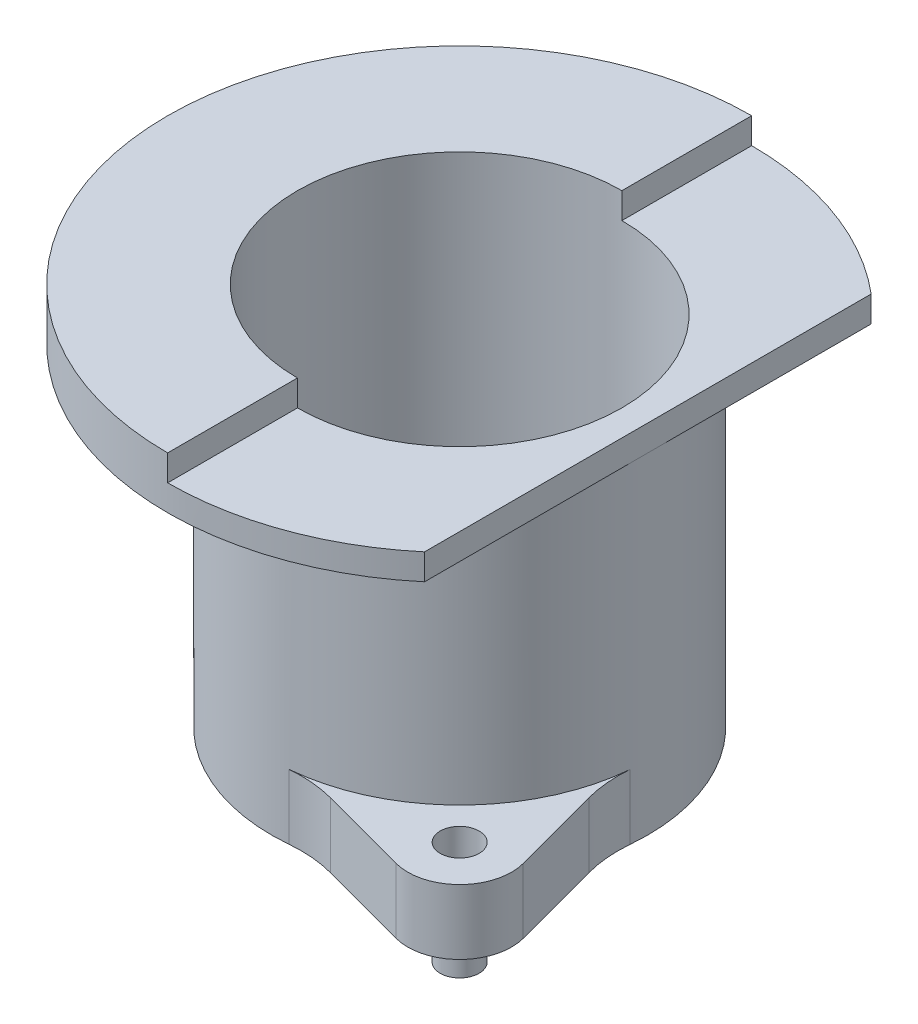
ISO-10303-21;
HEADER;
FILE_DESCRIPTION(('STEP AP214'),'2;1');
FILE_NAME('part.step','',(''),(''),'','','');
FILE_SCHEMA(('AUTOMOTIVE_DESIGN { 1 0 10303 214 1 1 1 1 }'));
ENDSEC;
DATA;
#1=APPLICATION_CONTEXT('core data for automotive mechanical design processes');
#2=APPLICATION_PROTOCOL_DEFINITION('international standard','automotive_design',2000,#1);
#3=PRODUCT_CONTEXT('',#1,'mechanical');
#4=PRODUCT('Part','Part','',(#3));
#5=PRODUCT_RELATED_PRODUCT_CATEGORY('part','',(#4));
#6=PRODUCT_DEFINITION_FORMATION('','',#4);
#7=PRODUCT_DEFINITION_CONTEXT('part definition',#1,'design');
#8=PRODUCT_DEFINITION('design','',#6,#7);
#9=PRODUCT_DEFINITION_SHAPE('','',#8);
#10=(LENGTH_UNIT() NAMED_UNIT(*) SI_UNIT(.MILLI.,.METRE.));
#11=(NAMED_UNIT(*) PLANE_ANGLE_UNIT() SI_UNIT($,.RADIAN.));
#12=(NAMED_UNIT(*) SI_UNIT($,.STERADIAN.) SOLID_ANGLE_UNIT());
#13=UNCERTAINTY_MEASURE_WITH_UNIT(LENGTH_MEASURE(1.E-05),#10,'distance_accuracy_value','');
#14=(GEOMETRIC_REPRESENTATION_CONTEXT(3) GLOBAL_UNCERTAINTY_ASSIGNED_CONTEXT((#13)) GLOBAL_UNIT_ASSIGNED_CONTEXT((#10,
#11,#12)) REPRESENTATION_CONTEXT('',''));
#15=CARTESIAN_POINT('',(0.,0.,0.));
#16=DIRECTION('',(0.,0.,1.));
#17=DIRECTION('',(1.,0.,0.));
#18=AXIS2_PLACEMENT_3D('',#15,#16,#17);
#19=CARTESIAN_POINT('',(12.7279220613579,-3.,12.7279220613577));
#20=DIRECTION('',(0.,1.,0.));
#21=DIRECTION('',(0.,0.,-1.));
#22=AXIS2_PLACEMENT_3D('',#19,#20,#21);
#23=CYLINDRICAL_SURFACE('',#22,1.49999999999999);
#24=CARTESIAN_POINT('',(12.7279220613579,-3.,12.7279220613577));
#25=DIRECTION('',(0.,1.,0.));
#26=DIRECTION('',(0.,0.,-1.));
#27=AXIS2_PLACEMENT_3D('',#24,#25,#26);
#28=CIRCLE('',#27,1.49999999999999);
#29=CARTESIAN_POINT('',(12.7279220613579,-3.,11.2279220613577));
#30=VERTEX_POINT('',#29);
#31=EDGE_CURVE('E54',#30,#30,#28,.T.);
#32=ORIENTED_EDGE('',*,*,#31,.F.);
#33=EDGE_LOOP('',(#32));
#34=FACE_BOUND('',#33,.T.);
#35=CARTESIAN_POINT('',(12.7279220613579,0.,12.7279220613577));
#36=DIRECTION('',(0.,1.,0.));
#37=DIRECTION('',(0.,0.,-1.));
#38=AXIS2_PLACEMENT_3D('',#35,#36,#37);
#39=CIRCLE('',#38,1.49999999999999);
#40=CARTESIAN_POINT('',(12.7279220613579,0.,11.2279220613577));
#41=VERTEX_POINT('',#40);
#42=EDGE_CURVE('E12',#41,#41,#39,.T.);
#43=ORIENTED_EDGE('',*,*,#42,.T.);
#44=EDGE_LOOP('',(#43));
#45=FACE_BOUND('',#44,.T.);
#46=ADVANCED_FACE('F49',(#34,#45),#23,.F.);
#47=OPEN_SHELL('',(#46));
#48=SHELL_BASED_SURFACE_MODEL('B2',(#47));
#49=CARTESIAN_POINT('',(-12.7279220613579,-3.,-12.7279220613578));
#50=DIRECTION('',(0.,1.,0.));
#51=DIRECTION('',(0.,0.,-1.));
#52=AXIS2_PLACEMENT_3D('',#49,#50,#51);
#53=CYLINDRICAL_SURFACE('',#52,1.50000000000001);
#54=CARTESIAN_POINT('',(-12.7279220613579,-3.,-12.7279220613578));
#55=DIRECTION('',(0.,1.,0.));
#56=DIRECTION('',(0.,0.,-1.));
#57=AXIS2_PLACEMENT_3D('',#54,#55,#56);
#58=CIRCLE('',#57,1.50000000000001);
#59=CARTESIAN_POINT('',(-12.7279220613579,-3.,-14.2279220613579));
#60=VERTEX_POINT('',#59);
#61=EDGE_CURVE('E90',#60,#60,#58,.T.);
#62=ORIENTED_EDGE('',*,*,#61,.F.);
#63=EDGE_LOOP('',(#62));
#64=FACE_BOUND('',#63,.T.);
#65=CARTESIAN_POINT('',(-12.7279220613579,0.,-12.7279220613578));
#66=DIRECTION('',(0.,1.,0.));
#67=DIRECTION('',(0.,0.,-1.));
#68=AXIS2_PLACEMENT_3D('',#65,#66,#67);
#69=CIRCLE('',#68,1.50000000000001);
#70=CARTESIAN_POINT('',(-12.7279220613579,0.,-14.2279220613579));
#71=VERTEX_POINT('',#70);
#72=EDGE_CURVE('E47',#71,#71,#69,.T.);
#73=ORIENTED_EDGE('',*,*,#72,.T.);
#74=EDGE_LOOP('',(#73));
#75=FACE_BOUND('',#74,.T.);
#76=ADVANCED_FACE('F85',(#64,#75),#53,.F.);
#77=OPEN_SHELL('',(#76));
#78=SHELL_BASED_SURFACE_MODEL('B6',(#77));
#79=CARTESIAN_POINT('',(0.,0.,0.));
#80=DIRECTION('',(0.,1.,0.));
#81=DIRECTION('',(0.,0.,1.));
#82=AXIS2_PLACEMENT_3D('',#79,#80,#81);
#83=PLANE('',#82);
#84=CARTESIAN_POINT('',(0.,0.,0.));
#85=DIRECTION('',(0.,1.,0.));
#86=DIRECTION('',(0.,0.,1.));
#87=AXIS2_PLACEMENT_3D('',#84,#85,#86);
#88=CIRCLE('',#87,14.5);
#89=CARTESIAN_POINT('',(14.4413952553677,0.,1.30234522237487));
#90=VERTEX_POINT('',#89);
#91=CARTESIAN_POINT('',(-1.30234522237493,0.,-14.4413952553677));
#92=VERTEX_POINT('',#91);
#93=EDGE_CURVE('E505',#90,#92,#88,.T.);
#94=ORIENTED_EDGE('',*,*,#93,.F.);
#95=CARTESIAN_POINT('',(24.4009781901041,0.,2.2005143412541));
#96=DIRECTION('',(0.,1.,0.));
#97=DIRECTION('',(0.,0.,1.));
#98=AXIS2_PLACEMENT_3D('',#95,#96,#97);
#99=CIRCLE('',#98,10.);
#100=CARTESIAN_POINT('',(14.7417199272134,0.,4.78870479227938));
#101=VERTEX_POINT('',#100);
#102=EDGE_CURVE('E541',#90,#101,#99,.T.);
#103=ORIENTED_EDGE('',*,*,#102,.T.);
#104=DIRECTION('',(-0.258819045102528,0.,-0.965925826289066));
#105=VECTOR('',#104,1.);
#106=CARTESIAN_POINT('',(12.5570357417578,0.,-3.36464758633286));
#107=LINE('',#106,#105);
#108=CARTESIAN_POINT('',(16.5916253665142,0.,11.6926458809476));
#109=VERTEX_POINT('',#108);
#110=EDGE_CURVE('E435',#109,#101,#107,.T.);
#111=ORIENTED_EDGE('',*,*,#110,.F.);
#112=CARTESIAN_POINT('',(12.7279220613579,0.,12.7279220613577));
#113=DIRECTION('',(0.,-1.,0.));
#114=DIRECTION('',(0.,0.,-1.));
#115=AXIS2_PLACEMENT_3D('',#112,#113,#114);
#116=CIRCLE('',#115,4.);
#117=CARTESIAN_POINT('',(11.6926458809478,0.,16.591625366514));
#118=VERTEX_POINT('',#117);
#119=EDGE_CURVE('E438',#118,#109,#116,.F.);
#120=ORIENTED_EDGE('',*,*,#119,.F.);
#121=DIRECTION('',(-0.965925826289069,0.,-0.258819045102519));
#122=VECTOR('',#121,1.);
#123=CARTESIAN_POINT('',(-3.36464758633272,0.,12.5570357417578));
#124=LINE('',#123,#122);
#125=CARTESIAN_POINT('',(4.78870479227972,0.,14.7417199272134));
#126=VERTEX_POINT('',#125);
#127=EDGE_CURVE('E440',#118,#126,#124,.T.);
#128=ORIENTED_EDGE('',*,*,#127,.T.);
#129=CARTESIAN_POINT('',(2.20051434125453,0.,24.400978190104));
#130=DIRECTION('',(0.,1.,0.));
#131=DIRECTION('',(0.,0.,1.));
#132=AXIS2_PLACEMENT_3D('',#129,#130,#131);
#133=CIRCLE('',#132,10.);
#134=CARTESIAN_POINT('',(1.30234522237513,0.,14.4413952553677));
#135=VERTEX_POINT('',#134);
#136=EDGE_CURVE('E267',#126,#135,#133,.T.);
#137=ORIENTED_EDGE('',*,*,#136,.T.);
#138=CARTESIAN_POINT('',(-14.4413952553677,0.,-1.3023452223749));
#139=VERTEX_POINT('',#138);
#140=EDGE_CURVE('E500',#139,#135,#88,.T.);
#141=ORIENTED_EDGE('',*,*,#140,.F.);
#142=CARTESIAN_POINT('',(-24.4009781901041,0.,-2.20051434125414));
#143=DIRECTION('',(0.,1.,0.));
#144=DIRECTION('',(0.,0.,1.));
#145=AXIS2_PLACEMENT_3D('',#142,#143,#144);
#146=CIRCLE('',#145,10.);
#147=CARTESIAN_POINT('',(-14.7417199272134,0.,-4.78870479227943));
#148=VERTEX_POINT('',#147);
#149=EDGE_CURVE('E533',#139,#148,#146,.T.);
#150=ORIENTED_EDGE('',*,*,#149,.T.);
#151=DIRECTION('',(0.258819045102528,0.,0.965925826289066));
#152=VECTOR('',#151,1.);
#153=CARTESIAN_POINT('',(-12.5570357417578,0.,3.36464758633285));
#154=LINE('',#153,#152);
#155=CARTESIAN_POINT('',(-16.5916253665142,0.,-11.6926458809477));
#156=VERTEX_POINT('',#155);
#157=EDGE_CURVE('E429',#156,#148,#154,.T.);
#158=ORIENTED_EDGE('',*,*,#157,.F.);
#159=CARTESIAN_POINT('',(-12.7279220613579,0.,-12.7279220613578));
#160=DIRECTION('',(0.,-1.,0.));
#161=DIRECTION('',(0.,0.,-1.));
#162=AXIS2_PLACEMENT_3D('',#159,#160,#161);
#163=CIRCLE('',#162,4.);
#164=CARTESIAN_POINT('',(-11.6926458809478,0.,-16.5916253665141));
#165=VERTEX_POINT('',#164);
#166=EDGE_CURVE('E392',#156,#165,#163,.T.);
#167=ORIENTED_EDGE('',*,*,#166,.T.);
#168=DIRECTION('',(0.965925826289069,0.,0.258819045102518));
#169=VECTOR('',#168,1.);
#170=CARTESIAN_POINT('',(3.36464758633274,0.,-12.5570357417579));
#171=LINE('',#170,#169);
#172=CARTESIAN_POINT('',(-4.78870479227937,0.,-14.7417199272134));
#173=VERTEX_POINT('',#172);
#174=EDGE_CURVE('E432',#165,#173,#171,.T.);
#175=ORIENTED_EDGE('',*,*,#174,.T.);
#176=CARTESIAN_POINT('',(-2.20051434125419,0.,-24.4009781901041));
#177=DIRECTION('',(0.,1.,0.));
#178=DIRECTION('',(0.,0.,1.));
#179=AXIS2_PLACEMENT_3D('',#176,#177,#178);
#180=CIRCLE('',#179,10.);
#181=EDGE_CURVE('E537',#173,#92,#180,.T.);
#182=ORIENTED_EDGE('',*,*,#181,.T.);
#183=EDGE_LOOP('',(#94,#103,#111,#120,#128,#137,#141,#150,#158,#167,#175,#182));
#184=FACE_BOUND('',#183,.T.);
#185=CARTESIAN_POINT('',(0.,0.,0.));
#186=DIRECTION('',(0.,1.,0.));
#187=DIRECTION('',(0.,0.,1.));
#188=AXIS2_PLACEMENT_3D('',#185,#186,#187);
#189=CIRCLE('',#188,12.5);
#190=CARTESIAN_POINT('',(0.,0.,12.5));
#191=VERTEX_POINT('',#190);
#192=EDGE_CURVE('E494',#191,#191,#189,.T.);
#193=ORIENTED_EDGE('',*,*,#192,.T.);
#194=EDGE_LOOP('',(#193));
#195=FACE_BOUND('',#194,.T.);
#196=CARTESIAN_POINT('',(-12.7279220613579,0.,-12.7279220613578));
#197=DIRECTION('',(0.,-1.,0.));
#198=DIRECTION('',(0.,0.,-1.));
#199=AXIS2_PLACEMENT_3D('',#196,#197,#198);
#200=CIRCLE('',#199,1.50000000000001);
#201=CARTESIAN_POINT('',(-12.7279220613579,0.,-14.2279220613579));
#202=VERTEX_POINT('',#201);
#203=EDGE_CURVE('E426',#202,#202,#200,.T.);
#204=ORIENTED_EDGE('',*,*,#203,.F.);
#205=EDGE_LOOP('',(#204));
#206=FACE_BOUND('',#205,.T.);
#207=CARTESIAN_POINT('',(12.7279220613579,0.,12.7279220613577));
#208=DIRECTION('',(0.,-1.,0.));
#209=DIRECTION('',(0.,0.,-1.));
#210=AXIS2_PLACEMENT_3D('',#207,#208,#209);
#211=CIRCLE('',#210,1.49999999999999);
#212=CARTESIAN_POINT('',(12.7279220613579,0.,11.2279220613577));
#213=VERTEX_POINT('',#212);
#214=EDGE_CURVE('E443',#213,#213,#211,.T.);
#215=ORIENTED_EDGE('',*,*,#214,.F.);
#216=EDGE_LOOP('',(#215));
#217=FACE_BOUND('',#216,.T.);
#218=ADVANCED_FACE('F259',(#184,#195,#206,#217),#83,.F.);
#219=CARTESIAN_POINT('',(0.,25.5,0.));
#220=DIRECTION('',(0.,-1.,0.));
#221=DIRECTION('',(0.,0.,-1.));
#222=AXIS2_PLACEMENT_3D('',#219,#220,#221);
#223=CYLINDRICAL_SURFACE('',#222,14.5);
#224=CARTESIAN_POINT('',(0.,5.,0.));
#225=DIRECTION('',(0.,-1.,0.));
#226=DIRECTION('',(0.,0.,-1.));
#227=AXIS2_PLACEMENT_3D('',#224,#225,#226);
#228=CIRCLE('',#227,14.5);
#229=CARTESIAN_POINT('',(-14.4413952553677,5.,-1.3023452223749));
#230=VERTEX_POINT('',#229);
#231=CARTESIAN_POINT('',(-1.30234522237493,5.,-14.4413952553677));
#232=VERTEX_POINT('',#231);
#233=EDGE_CURVE('E448',#230,#232,#228,.T.);
#234=ORIENTED_EDGE('',*,*,#233,.F.);
#235=DIRECTION('',(0.,-1.,0.));
#236=VECTOR('',#235,1.);
#237=CARTESIAN_POINT('',(-14.4413952553677,25.5,-1.3023452223749));
#238=LINE('',#237,#236);
#239=EDGE_CURVE('E522',#230,#139,#238,.T.);
#240=ORIENTED_EDGE('',*,*,#239,.T.);
#241=ORIENTED_EDGE('',*,*,#140,.T.);
#242=DIRECTION('',(0.,-1.,0.));
#243=VECTOR('',#242,1.);
#244=CARTESIAN_POINT('',(1.30234522237513,25.5,14.4413952553677));
#245=LINE('',#244,#243);
#246=CARTESIAN_POINT('',(1.30234522237513,5.,14.4413952553677));
#247=VERTEX_POINT('',#246);
#248=EDGE_CURVE('E513',#135,#247,#245,.F.);
#249=ORIENTED_EDGE('',*,*,#248,.T.);
#250=CARTESIAN_POINT('',(14.4413952553677,5.,1.30234522237487));
#251=VERTEX_POINT('',#250);
#252=EDGE_CURVE('E454',#251,#247,#228,.T.);
#253=ORIENTED_EDGE('',*,*,#252,.F.);
#254=DIRECTION('',(0.,-1.,0.));
#255=VECTOR('',#254,1.);
#256=CARTESIAN_POINT('',(14.4413952553677,25.5,1.30234522237487));
#257=LINE('',#256,#255);
#258=EDGE_CURVE('E516',#251,#90,#257,.T.);
#259=ORIENTED_EDGE('',*,*,#258,.T.);
#260=ORIENTED_EDGE('',*,*,#93,.T.);
#261=DIRECTION('',(0.,-1.,0.));
#262=VECTOR('',#261,1.);
#263=CARTESIAN_POINT('',(-1.30234522237493,25.5,-14.4413952553677));
#264=LINE('',#263,#262);
#265=EDGE_CURVE('E519',#92,#232,#264,.F.);
#266=ORIENTED_EDGE('',*,*,#265,.T.);
#267=EDGE_LOOP('',(#234,#240,#241,#249,#253,#259,#260,#266));
#268=FACE_BOUND('',#267,.T.);
#269=CARTESIAN_POINT('',(0.,25.5,0.));
#270=DIRECTION('',(0.,1.,0.));
#271=DIRECTION('',(0.,0.,1.));
#272=AXIS2_PLACEMENT_3D('',#269,#270,#271);
#273=CIRCLE('',#272,14.5);
#274=CARTESIAN_POINT('',(14.5,25.5,0.));
#275=VERTEX_POINT('',#274);
#276=EDGE_CURVE('E501',#275,#275,#273,.T.);
#277=ORIENTED_EDGE('',*,*,#276,.F.);
#278=EDGE_LOOP('',(#277));
#279=FACE_BOUND('',#278,.T.);
#280=ADVANCED_FACE('F552',(#268,#279),#223,.T.);
#281=CARTESIAN_POINT('',(0.,25.5,0.));
#282=DIRECTION('',(0.,-1.,0.));
#283=DIRECTION('',(0.,0.,-1.));
#284=AXIS2_PLACEMENT_3D('',#281,#282,#283);
#285=CYLINDRICAL_SURFACE('',#284,12.5);
#286=ORIENTED_EDGE('',*,*,#192,.F.);
#287=EDGE_LOOP('',(#286));
#288=FACE_BOUND('',#287,.T.);
#289=CARTESIAN_POINT('',(0.,27.5,0.));
#290=DIRECTION('',(0.,1.,0.));
#291=DIRECTION('',(0.,0.,1.));
#292=AXIS2_PLACEMENT_3D('',#289,#290,#291);
#293=CIRCLE('',#292,12.5);
#294=CARTESIAN_POINT('',(0.,27.5,12.5));
#295=VERTEX_POINT('',#294);
#296=CARTESIAN_POINT('',(0.,27.5,-12.5));
#297=VERTEX_POINT('',#296);
#298=EDGE_CURVE('E487',#295,#297,#293,.T.);
#299=ORIENTED_EDGE('',*,*,#298,.T.);
#300=DIRECTION('',(0.,-1.,0.));
#301=VECTOR('',#300,1.);
#302=CARTESIAN_POINT('',(0.,29.5,-12.5));
#303=LINE('',#302,#301);
#304=CARTESIAN_POINT('',(0.,29.5,-12.5));
#305=VERTEX_POINT('',#304);
#306=EDGE_CURVE('E484',#305,#297,#303,.T.);
#307=ORIENTED_EDGE('',*,*,#306,.F.);
#308=CARTESIAN_POINT('',(0.,29.5,0.));
#309=DIRECTION('',(0.,-1.,0.));
#310=DIRECTION('',(0.,0.,1.));
#311=AXIS2_PLACEMENT_3D('',#308,#309,#310);
#312=CIRCLE('',#311,12.5);
#313=CARTESIAN_POINT('',(0.,29.5,12.5));
#314=VERTEX_POINT('',#313);
#315=EDGE_CURVE('E461',#314,#305,#312,.T.);
#316=ORIENTED_EDGE('',*,*,#315,.F.);
#317=DIRECTION('',(0.,-1.,0.));
#318=VECTOR('',#317,1.);
#319=CARTESIAN_POINT('',(0.,29.5,12.5));
#320=LINE('',#319,#318);
#321=EDGE_CURVE('E471',#314,#295,#320,.T.);
#322=ORIENTED_EDGE('',*,*,#321,.T.);
#323=EDGE_LOOP('',(#299,#307,#316,#322));
#324=FACE_BOUND('',#323,.T.);
#325=ADVANCED_FACE('F598',(#288,#324),#285,.F.);
#326=CARTESIAN_POINT('',(0.,27.5,0.));
#327=DIRECTION('',(0.,1.,0.));
#328=DIRECTION('',(0.,0.,1.));
#329=AXIS2_PLACEMENT_3D('',#326,#327,#328);
#330=PLANE('',#329);
#331=DIRECTION('',(0.,0.,1.));
#332=VECTOR('',#331,1.);
#333=CARTESIAN_POINT('',(14.5,27.5,0.));
#334=LINE('',#333,#332);
#335=CARTESIAN_POINT('',(14.5,27.5,-17.2046505340853));
#336=VERTEX_POINT('',#335);
#337=CARTESIAN_POINT('',(14.5,27.5,17.2046505340853));
#338=VERTEX_POINT('',#337);
#339=EDGE_CURVE('E458',#336,#338,#334,.T.);
#340=ORIENTED_EDGE('',*,*,#339,.F.);
#341=CARTESIAN_POINT('',(0.,27.5,0.));
#342=DIRECTION('',(0.,1.,0.));
#343=DIRECTION('',(0.,0.,1.));
#344=AXIS2_PLACEMENT_3D('',#341,#342,#343);
#345=CIRCLE('',#344,22.5);
#346=CARTESIAN_POINT('',(0.,27.5,-22.5));
#347=VERTEX_POINT('',#346);
#348=EDGE_CURVE('E495',#336,#347,#345,.T.);
#349=ORIENTED_EDGE('',*,*,#348,.T.);
#350=DIRECTION('',(0.,0.,-1.));
#351=VECTOR('',#350,1.);
#352=CARTESIAN_POINT('',(0.,27.5,-22.5));
#353=LINE('',#352,#351);
#354=EDGE_CURVE('E460',#297,#347,#353,.T.);
#355=ORIENTED_EDGE('',*,*,#354,.F.);
#356=ORIENTED_EDGE('',*,*,#298,.F.);
#357=DIRECTION('',(0.,0.,-1.));
#358=VECTOR('',#357,1.);
#359=CARTESIAN_POINT('',(0.,27.5,12.5));
#360=LINE('',#359,#358);
#361=CARTESIAN_POINT('',(0.,27.5,22.5));
#362=VERTEX_POINT('',#361);
#363=EDGE_CURVE('E465',#362,#295,#360,.T.);
#364=ORIENTED_EDGE('',*,*,#363,.F.);
#365=EDGE_CURVE('E491',#362,#338,#345,.T.);
#366=ORIENTED_EDGE('',*,*,#365,.T.);
#367=EDGE_LOOP('',(#340,#349,#355,#356,#364,#366));
#368=FACE_BOUND('',#367,.T.);
#369=ADVANCED_FACE('F602',(#368),#330,.T.);
#370=CARTESIAN_POINT('',(0.,25.5,0.));
#371=DIRECTION('',(0.,1.,0.));
#372=DIRECTION('',(0.,0.,1.));
#373=AXIS2_PLACEMENT_3D('',#370,#371,#372);
#374=PLANE('',#373);
#375=CARTESIAN_POINT('',(0.,25.5,0.));
#376=DIRECTION('',(0.,1.,0.));
#377=DIRECTION('',(0.,0.,1.));
#378=AXIS2_PLACEMENT_3D('',#375,#376,#377);
#379=CIRCLE('',#378,22.5);
#380=CARTESIAN_POINT('',(14.5,25.5,-17.2046505340853));
#381=VERTEX_POINT('',#380);
#382=CARTESIAN_POINT('',(14.5,25.5,17.2046505340853));
#383=VERTEX_POINT('',#382);
#384=EDGE_CURVE('E490',#381,#383,#379,.T.);
#385=ORIENTED_EDGE('',*,*,#384,.F.);
#386=DIRECTION('',(0.,0.,-1.));
#387=VECTOR('',#386,1.);
#388=CARTESIAN_POINT('',(14.5,25.5,29.3957895137127));
#389=LINE('',#388,#387);
#390=EDGE_CURVE('E455',#275,#381,#389,.T.);
#391=ORIENTED_EDGE('',*,*,#390,.F.);
#392=ORIENTED_EDGE('',*,*,#276,.T.);
#393=EDGE_CURVE('E457',#383,#275,#389,.T.);
#394=ORIENTED_EDGE('',*,*,#393,.F.);
#395=EDGE_LOOP('',(#385,#391,#392,#394));
#396=FACE_BOUND('',#395,.T.);
#397=ADVANCED_FACE('F608',(#396),#374,.F.);
#398=CARTESIAN_POINT('',(0.,27.5,0.));
#399=DIRECTION('',(0.,-1.,0.));
#400=DIRECTION('',(0.,0.,-1.));
#401=AXIS2_PLACEMENT_3D('',#398,#399,#400);
#402=CYLINDRICAL_SURFACE('',#401,22.5);
#403=ORIENTED_EDGE('',*,*,#348,.F.);
#404=DIRECTION('',(0.,-1.,0.));
#405=VECTOR('',#404,1.);
#406=CARTESIAN_POINT('',(14.5,27.5,-17.2046505340853));
#407=LINE('',#406,#405);
#408=EDGE_CURVE('E510',#336,#381,#407,.T.);
#409=ORIENTED_EDGE('',*,*,#408,.T.);
#410=ORIENTED_EDGE('',*,*,#384,.T.);
#411=DIRECTION('',(0.,-1.,0.));
#412=VECTOR('',#411,1.);
#413=CARTESIAN_POINT('',(14.5,27.5,17.2046505340853));
#414=LINE('',#413,#412);
#415=EDGE_CURVE('E504',#383,#338,#414,.F.);
#416=ORIENTED_EDGE('',*,*,#415,.T.);
#417=ORIENTED_EDGE('',*,*,#365,.F.);
#418=DIRECTION('',(0.,-1.,0.));
#419=VECTOR('',#418,1.);
#420=CARTESIAN_POINT('',(0.,29.5,22.5));
#421=LINE('',#420,#419);
#422=CARTESIAN_POINT('',(0.,29.5,22.5));
#423=VERTEX_POINT('',#422);
#424=EDGE_CURVE('E478',#423,#362,#421,.T.);
#425=ORIENTED_EDGE('',*,*,#424,.F.);
#426=CARTESIAN_POINT('',(0.,29.5,0.));
#427=DIRECTION('',(0.,1.,0.));
#428=DIRECTION('',(0.,0.,1.));
#429=AXIS2_PLACEMENT_3D('',#426,#427,#428);
#430=CIRCLE('',#429,22.5);
#431=CARTESIAN_POINT('',(0.,29.5,-22.5));
#432=VERTEX_POINT('',#431);
#433=EDGE_CURVE('E467',#432,#423,#430,.T.);
#434=ORIENTED_EDGE('',*,*,#433,.F.);
#435=DIRECTION('',(0.,-1.,0.));
#436=VECTOR('',#435,1.);
#437=CARTESIAN_POINT('',(0.,29.5,-22.5));
#438=LINE('',#437,#436);
#439=EDGE_CURVE('E481',#432,#347,#438,.T.);
#440=ORIENTED_EDGE('',*,*,#439,.T.);
#441=EDGE_LOOP('',(#403,#409,#410,#416,#417,#425,#434,#440));
#442=FACE_BOUND('',#441,.T.);
#443=ADVANCED_FACE('F604',(#442),#402,.T.);
#444=CARTESIAN_POINT('',(0.,29.5,-22.5));
#445=DIRECTION('',(-1.,0.,0.));
#446=DIRECTION('',(0.,0.,1.));
#447=AXIS2_PLACEMENT_3D('',#444,#445,#446);
#448=PLANE('',#447);
#449=ORIENTED_EDGE('',*,*,#354,.T.);
#450=ORIENTED_EDGE('',*,*,#439,.F.);
#451=DIRECTION('',(0.,0.,-1.));
#452=VECTOR('',#451,1.);
#453=CARTESIAN_POINT('',(0.,29.5,-22.5));
#454=LINE('',#453,#452);
#455=EDGE_CURVE('E464',#305,#432,#454,.T.);
#456=ORIENTED_EDGE('',*,*,#455,.F.);
#457=ORIENTED_EDGE('',*,*,#306,.T.);
#458=EDGE_LOOP('',(#449,#450,#456,#457));
#459=FACE_BOUND('',#458,.T.);
#460=ADVANCED_FACE('F607',(#459),#448,.F.);
#461=CARTESIAN_POINT('',(0.,29.5,12.5));
#462=DIRECTION('',(-1.,0.,0.));
#463=DIRECTION('',(0.,0.,1.));
#464=AXIS2_PLACEMENT_3D('',#461,#462,#463);
#465=PLANE('',#464);
#466=ORIENTED_EDGE('',*,*,#363,.T.);
#467=ORIENTED_EDGE('',*,*,#321,.F.);
#468=DIRECTION('',(0.,0.,-1.));
#469=VECTOR('',#468,1.);
#470=CARTESIAN_POINT('',(0.,29.5,12.5));
#471=LINE('',#470,#469);
#472=EDGE_CURVE('E469',#423,#314,#471,.T.);
#473=ORIENTED_EDGE('',*,*,#472,.F.);
#474=ORIENTED_EDGE('',*,*,#424,.T.);
#475=EDGE_LOOP('',(#466,#467,#473,#474));
#476=FACE_BOUND('',#475,.T.);
#477=ADVANCED_FACE('F618',(#476),#465,.F.);
#478=CARTESIAN_POINT('',(0.,29.5,0.));
#479=DIRECTION('',(0.,1.,0.));
#480=DIRECTION('',(0.,0.,1.));
#481=AXIS2_PLACEMENT_3D('',#478,#479,#480);
#482=PLANE('',#481);
#483=ORIENTED_EDGE('',*,*,#315,.T.);
#484=ORIENTED_EDGE('',*,*,#455,.T.);
#485=ORIENTED_EDGE('',*,*,#433,.T.);
#486=ORIENTED_EDGE('',*,*,#472,.T.);
#487=EDGE_LOOP('',(#483,#484,#485,#486));
#488=FACE_BOUND('',#487,.T.);
#489=ADVANCED_FACE('F622',(#488),#482,.T.);
#490=CARTESIAN_POINT('',(14.5,35.5,29.3957895137127));
#491=DIRECTION('',(-1.,0.,0.));
#492=DIRECTION('',(0.,0.,1.));
#493=AXIS2_PLACEMENT_3D('',#490,#491,#492);
#494=PLANE('',#493);
#495=ORIENTED_EDGE('',*,*,#339,.T.);
#496=ORIENTED_EDGE('',*,*,#415,.F.);
#497=ORIENTED_EDGE('',*,*,#393,.T.);
#498=ORIENTED_EDGE('',*,*,#390,.T.);
#499=ORIENTED_EDGE('',*,*,#408,.F.);
#500=EDGE_LOOP('',(#495,#496,#497,#498,#499));
#501=FACE_BOUND('',#500,.T.);
#502=ADVANCED_FACE('F626',(#501),#494,.F.);
#503=CARTESIAN_POINT('',(-12.7279220613579,5.,-12.7279220613578));
#504=DIRECTION('',(0.,-1.,0.));
#505=DIRECTION('',(0.,0.,-1.));
#506=AXIS2_PLACEMENT_3D('',#503,#504,#505);
#507=CYLINDRICAL_SURFACE('',#506,4.);
#508=ORIENTED_EDGE('',*,*,#166,.F.);
#509=DIRECTION('',(0.,-1.,0.));
#510=VECTOR('',#509,1.);
#511=CARTESIAN_POINT('',(-16.5916253665142,5.,-11.6926458809477));
#512=LINE('',#511,#510);
#513=CARTESIAN_POINT('',(-16.5916253665142,5.,-11.6926458809477));
#514=VERTEX_POINT('',#513);
#515=EDGE_CURVE('E386',#514,#156,#512,.T.);
#516=ORIENTED_EDGE('',*,*,#515,.F.);
#517=CARTESIAN_POINT('',(-12.7279220613579,5.,-12.7279220613578));
#518=DIRECTION('',(0.,-1.,0.));
#519=DIRECTION('',(0.,0.,-1.));
#520=AXIS2_PLACEMENT_3D('',#517,#518,#519);
#521=CIRCLE('',#520,4.);
#522=CARTESIAN_POINT('',(-11.6926458809478,5.,-16.5916253665141));
#523=VERTEX_POINT('',#522);
#524=EDGE_CURVE('E390',#514,#523,#521,.T.);
#525=ORIENTED_EDGE('',*,*,#524,.T.);
#526=DIRECTION('',(0.,-1.,0.));
#527=VECTOR('',#526,1.);
#528=CARTESIAN_POINT('',(-11.6926458809478,5.,-16.5916253665141));
#529=LINE('',#528,#527);
#530=EDGE_CURVE('E396',#523,#165,#529,.T.);
#531=ORIENTED_EDGE('',*,*,#530,.T.);
#532=EDGE_LOOP('',(#508,#516,#525,#531));
#533=FACE_BOUND('',#532,.T.);
#534=ADVANCED_FACE('F388',(#533),#507,.T.);
#535=CARTESIAN_POINT('',(-12.7279220613579,5.,-12.7279220613578));
#536=DIRECTION('',(0.,-1.,0.));
#537=DIRECTION('',(0.,0.,-1.));
#538=AXIS2_PLACEMENT_3D('',#535,#536,#537);
#539=CYLINDRICAL_SURFACE('',#538,1.50000000000001);
#540=CARTESIAN_POINT('',(-12.7279220613579,5.,-12.7279220613578));
#541=DIRECTION('',(0.,-1.,0.));
#542=DIRECTION('',(0.,0.,-1.));
#543=AXIS2_PLACEMENT_3D('',#540,#541,#542);
#544=CIRCLE('',#543,1.50000000000001);
#545=CARTESIAN_POINT('',(-12.7279220613579,5.,-14.2279220613579));
#546=VERTEX_POINT('',#545);
#547=EDGE_CURVE('E407',#546,#546,#544,.T.);
#548=ORIENTED_EDGE('',*,*,#547,.F.);
#549=EDGE_LOOP('',(#548));
#550=FACE_BOUND('',#549,.T.);
#551=ORIENTED_EDGE('',*,*,#203,.T.);
#552=EDGE_LOOP('',(#551));
#553=FACE_BOUND('',#552,.T.);
#554=ADVANCED_FACE('F631',(#550,#553),#539,.F.);
#555=CARTESIAN_POINT('',(0.,5.,0.));
#556=DIRECTION('',(0.,-1.,0.));
#557=DIRECTION('',(0.,0.,-1.));
#558=AXIS2_PLACEMENT_3D('',#555,#556,#557);
#559=PLANE('',#558);
#560=ORIENTED_EDGE('',*,*,#547,.T.);
#561=EDGE_LOOP('',(#560));
#562=FACE_BOUND('',#561,.T.);
#563=DIRECTION('',(0.258819045102528,0.,0.965925826289066));
#564=VECTOR('',#563,1.);
#565=CARTESIAN_POINT('',(-12.5570357417578,5.,3.36464758633285));
#566=LINE('',#565,#564);
#567=CARTESIAN_POINT('',(-14.7417199272134,5.,-4.78870479227943));
#568=VERTEX_POINT('',#567);
#569=EDGE_CURVE('E400',#514,#568,#566,.T.);
#570=ORIENTED_EDGE('',*,*,#569,.T.);
#571=CARTESIAN_POINT('',(-24.4009781901041,5.,-2.20051434125414));
#572=DIRECTION('',(0.,-1.,0.));
#573=DIRECTION('',(0.,0.,-1.));
#574=AXIS2_PLACEMENT_3D('',#571,#572,#573);
#575=CIRCLE('',#574,10.);
#576=EDGE_CURVE('E535',#568,#230,#575,.T.);
#577=ORIENTED_EDGE('',*,*,#576,.T.);
#578=ORIENTED_EDGE('',*,*,#233,.T.);
#579=CARTESIAN_POINT('',(-2.20051434125419,5.,-24.4009781901041));
#580=DIRECTION('',(0.,-1.,0.));
#581=DIRECTION('',(0.,0.,-1.));
#582=AXIS2_PLACEMENT_3D('',#579,#580,#581);
#583=CIRCLE('',#582,10.);
#584=CARTESIAN_POINT('',(-4.78870479227937,5.,-14.7417199272134));
#585=VERTEX_POINT('',#584);
#586=EDGE_CURVE('E539',#232,#585,#583,.T.);
#587=ORIENTED_EDGE('',*,*,#586,.T.);
#588=DIRECTION('',(0.965925826289069,0.,0.258819045102518));
#589=VECTOR('',#588,1.);
#590=CARTESIAN_POINT('',(3.36464758633274,5.,-12.5570357417579));
#591=LINE('',#590,#589);
#592=EDGE_CURVE('E412',#523,#585,#591,.T.);
#593=ORIENTED_EDGE('',*,*,#592,.F.);
#594=ORIENTED_EDGE('',*,*,#524,.F.);
#595=EDGE_LOOP('',(#570,#577,#578,#587,#593,#594));
#596=FACE_BOUND('',#595,.T.);
#597=ADVANCED_FACE('F410',(#562,#596),#559,.F.);
#598=CARTESIAN_POINT('',(3.36464758633274,5.,-12.5570357417579));
#599=DIRECTION('',(0.258819045102518,0.,-0.965925826289069));
#600=DIRECTION('',(-0.965925826289069,0.,-0.258819045102518));
#601=AXIS2_PLACEMENT_3D('',#598,#599,#600);
#602=PLANE('',#601);
#603=ORIENTED_EDGE('',*,*,#592,.T.);
#604=DIRECTION('',(0.,-1.,0.));
#605=VECTOR('',#604,1.);
#606=CARTESIAN_POINT('',(-4.78870479227937,5.,-14.7417199272134));
#607=LINE('',#606,#605);
#608=EDGE_CURVE('E526',#585,#173,#607,.T.);
#609=ORIENTED_EDGE('',*,*,#608,.T.);
#610=ORIENTED_EDGE('',*,*,#174,.F.);
#611=ORIENTED_EDGE('',*,*,#530,.F.);
#612=EDGE_LOOP('',(#603,#609,#610,#611));
#613=FACE_BOUND('',#612,.T.);
#614=ADVANCED_FACE('F579',(#613),#602,.T.);
#615=CARTESIAN_POINT('',(-12.5570357417578,5.,3.36464758633285));
#616=DIRECTION('',(0.965925826289066,0.,-0.258819045102528));
#617=DIRECTION('',(-0.258819045102528,0.,-0.965925826289066));
#618=AXIS2_PLACEMENT_3D('',#615,#616,#617);
#619=PLANE('',#618);
#620=ORIENTED_EDGE('',*,*,#157,.T.);
#621=DIRECTION('',(0.,1.,0.));
#622=VECTOR('',#621,1.);
#623=CARTESIAN_POINT('',(-14.7417199272134,5.,-4.78870479227943));
#624=LINE('',#623,#622);
#625=EDGE_CURVE('E403',#148,#568,#624,.T.);
#626=ORIENTED_EDGE('',*,*,#625,.T.);
#627=ORIENTED_EDGE('',*,*,#569,.F.);
#628=ORIENTED_EDGE('',*,*,#515,.T.);
#629=EDGE_LOOP('',(#620,#626,#627,#628));
#630=FACE_BOUND('',#629,.T.);
#631=ADVANCED_FACE('F401',(#630),#619,.F.);
#632=CARTESIAN_POINT('',(12.7279220613579,5.,12.7279220613577));
#633=DIRECTION('',(0.,-1.,0.));
#634=DIRECTION('',(0.,0.,-1.));
#635=AXIS2_PLACEMENT_3D('',#632,#633,#634);
#636=CIRCLE('',#635,1.49999999999999);
#637=CARTESIAN_POINT('',(12.7279220613579,5.,11.2279220613577));
#638=VERTEX_POINT('',#637);
#639=EDGE_CURVE('E397',#638,#638,#636,.T.);
#640=ORIENTED_EDGE('',*,*,#639,.T.);
#641=EDGE_LOOP('',(#640));
#642=FACE_BOUND('',#641,.T.);
#643=DIRECTION('',(-0.258819045102528,0.,-0.965925826289066));
#644=VECTOR('',#643,1.);
#645=CARTESIAN_POINT('',(12.5570357417578,5.,-3.36464758633286));
#646=LINE('',#645,#644);
#647=CARTESIAN_POINT('',(16.5916253665142,5.,11.6926458809476));
#648=VERTEX_POINT('',#647);
#649=CARTESIAN_POINT('',(14.7417199272134,5.,4.78870479227938));
#650=VERTEX_POINT('',#649);
#651=EDGE_CURVE('E414',#648,#650,#646,.T.);
#652=ORIENTED_EDGE('',*,*,#651,.T.);
#653=CARTESIAN_POINT('',(24.4009781901041,5.,2.2005143412541));
#654=DIRECTION('',(0.,-1.,0.));
#655=DIRECTION('',(0.,0.,-1.));
#656=AXIS2_PLACEMENT_3D('',#653,#654,#655);
#657=CIRCLE('',#656,10.);
#658=EDGE_CURVE('E543',#650,#251,#657,.T.);
#659=ORIENTED_EDGE('',*,*,#658,.T.);
#660=ORIENTED_EDGE('',*,*,#252,.T.);
#661=CARTESIAN_POINT('',(2.20051434125453,5.,24.400978190104));
#662=DIRECTION('',(0.,-1.,0.));
#663=DIRECTION('',(0.,0.,-1.));
#664=AXIS2_PLACEMENT_3D('',#661,#662,#663);
#665=CIRCLE('',#664,10.);
#666=CARTESIAN_POINT('',(4.78870479227972,5.,14.7417199272134));
#667=VERTEX_POINT('',#666);
#668=EDGE_CURVE('E191',#247,#667,#665,.T.);
#669=ORIENTED_EDGE('',*,*,#668,.T.);
#670=DIRECTION('',(-0.965925826289069,0.,-0.258819045102519));
#671=VECTOR('',#670,1.);
#672=CARTESIAN_POINT('',(-3.36464758633272,5.,12.5570357417578));
#673=LINE('',#672,#671);
#674=CARTESIAN_POINT('',(11.6926458809478,5.,16.591625366514));
#675=VERTEX_POINT('',#674);
#676=EDGE_CURVE('E422',#675,#667,#673,.T.);
#677=ORIENTED_EDGE('',*,*,#676,.F.);
#678=CARTESIAN_POINT('',(12.7279220613579,5.,12.7279220613577));
#679=DIRECTION('',(0.,-1.,0.));
#680=DIRECTION('',(0.,0.,-1.));
#681=AXIS2_PLACEMENT_3D('',#678,#679,#680);
#682=CIRCLE('',#681,4.);
#683=EDGE_CURVE('E420',#675,#648,#682,.F.);
#684=ORIENTED_EDGE('',*,*,#683,.T.);
#685=EDGE_LOOP('',(#652,#659,#660,#669,#677,#684));
#686=FACE_BOUND('',#685,.T.);
#687=ADVANCED_FACE('F558',(#642,#686),#559,.F.);
#688=CARTESIAN_POINT('',(-3.36464758633272,5.,12.5570357417578));
#689=DIRECTION('',(-0.258819045102519,0.,0.965925826289069));
#690=DIRECTION('',(0.965925826289069,0.,0.258819045102519));
#691=AXIS2_PLACEMENT_3D('',#688,#689,#690);
#692=PLANE('',#691);
#693=ORIENTED_EDGE('',*,*,#676,.T.);
#694=DIRECTION('',(0.,-1.,0.));
#695=VECTOR('',#694,1.);
#696=CARTESIAN_POINT('',(4.78870479227972,5.,14.7417199272134));
#697=LINE('',#696,#695);
#698=EDGE_CURVE('E531',#667,#126,#697,.T.);
#699=ORIENTED_EDGE('',*,*,#698,.T.);
#700=ORIENTED_EDGE('',*,*,#127,.F.);
#701=DIRECTION('',(0.,-1.,0.));
#702=VECTOR('',#701,1.);
#703=CARTESIAN_POINT('',(11.6926458809478,5.,16.591625366514));
#704=LINE('',#703,#702);
#705=EDGE_CURVE('E446',#675,#118,#704,.T.);
#706=ORIENTED_EDGE('',*,*,#705,.F.);
#707=EDGE_LOOP('',(#693,#699,#700,#706));
#708=FACE_BOUND('',#707,.T.);
#709=ADVANCED_FACE('F556',(#708),#692,.T.);
#710=CARTESIAN_POINT('',(12.7279220613579,5.,12.7279220613577));
#711=DIRECTION('',(0.,-1.,0.));
#712=DIRECTION('',(0.,0.,-1.));
#713=AXIS2_PLACEMENT_3D('',#710,#711,#712);
#714=CYLINDRICAL_SURFACE('',#713,4.);
#715=ORIENTED_EDGE('',*,*,#119,.T.);
#716=DIRECTION('',(0.,-1.,0.));
#717=VECTOR('',#716,1.);
#718=CARTESIAN_POINT('',(16.5916253665142,5.,11.6926458809476));
#719=LINE('',#718,#717);
#720=EDGE_CURVE('E449',#648,#109,#719,.T.);
#721=ORIENTED_EDGE('',*,*,#720,.F.);
#722=ORIENTED_EDGE('',*,*,#683,.F.);
#723=ORIENTED_EDGE('',*,*,#705,.T.);
#724=EDGE_LOOP('',(#715,#721,#722,#723));
#725=FACE_BOUND('',#724,.T.);
#726=ADVANCED_FACE('F563',(#725),#714,.T.);
#727=CARTESIAN_POINT('',(12.5570357417578,5.,-3.36464758633286));
#728=DIRECTION('',(-0.965925826289066,0.,0.258819045102528));
#729=DIRECTION('',(0.258819045102528,0.,0.965925826289066));
#730=AXIS2_PLACEMENT_3D('',#727,#728,#729);
#731=PLANE('',#730);
#732=ORIENTED_EDGE('',*,*,#110,.T.);
#733=DIRECTION('',(0.,1.,0.));
#734=VECTOR('',#733,1.);
#735=CARTESIAN_POINT('',(14.7417199272134,5.,4.78870479227938));
#736=LINE('',#735,#734);
#737=EDGE_CURVE('E529',#101,#650,#736,.T.);
#738=ORIENTED_EDGE('',*,*,#737,.T.);
#739=ORIENTED_EDGE('',*,*,#651,.F.);
#740=ORIENTED_EDGE('',*,*,#720,.T.);
#741=EDGE_LOOP('',(#732,#738,#739,#740));
#742=FACE_BOUND('',#741,.T.);
#743=ADVANCED_FACE('F566',(#742),#731,.F.);
#744=CARTESIAN_POINT('',(12.7279220613579,5.,12.7279220613577));
#745=DIRECTION('',(0.,-1.,0.));
#746=DIRECTION('',(0.,0.,-1.));
#747=AXIS2_PLACEMENT_3D('',#744,#745,#746);
#748=CYLINDRICAL_SURFACE('',#747,1.49999999999999);
#749=ORIENTED_EDGE('',*,*,#639,.F.);
#750=EDGE_LOOP('',(#749));
#751=FACE_BOUND('',#750,.T.);
#752=ORIENTED_EDGE('',*,*,#214,.T.);
#753=EDGE_LOOP('',(#752));
#754=FACE_BOUND('',#753,.T.);
#755=ADVANCED_FACE('F583',(#751,#754),#748,.F.);
#756=CARTESIAN_POINT('',(-24.4009781901041,25.5,-2.20051434125414));
#757=DIRECTION('',(0.,-1.,0.));
#758=DIRECTION('',(0.,0.,-1.));
#759=AXIS2_PLACEMENT_3D('',#756,#757,#758);
#760=CYLINDRICAL_SURFACE('',#759,10.);
#761=ORIENTED_EDGE('',*,*,#576,.F.);
#762=ORIENTED_EDGE('',*,*,#625,.F.);
#763=ORIENTED_EDGE('',*,*,#149,.F.);
#764=ORIENTED_EDGE('',*,*,#239,.F.);
#765=EDGE_LOOP('',(#761,#762,#763,#764));
#766=FACE_BOUND('',#765,.T.);
#767=ADVANCED_FACE('F581',(#766),#760,.F.);
#768=CARTESIAN_POINT('',(-2.20051434125419,25.5,-24.4009781901041));
#769=DIRECTION('',(0.,-1.,0.));
#770=DIRECTION('',(0.,0.,-1.));
#771=AXIS2_PLACEMENT_3D('',#768,#769,#770);
#772=CYLINDRICAL_SURFACE('',#771,10.);
#773=ORIENTED_EDGE('',*,*,#586,.F.);
#774=ORIENTED_EDGE('',*,*,#265,.F.);
#775=ORIENTED_EDGE('',*,*,#181,.F.);
#776=ORIENTED_EDGE('',*,*,#608,.F.);
#777=EDGE_LOOP('',(#773,#774,#775,#776));
#778=FACE_BOUND('',#777,.T.);
#779=ADVANCED_FACE('F577',(#778),#772,.F.);
#780=CARTESIAN_POINT('',(24.4009781901041,25.5,2.2005143412541));
#781=DIRECTION('',(0.,-1.,0.));
#782=DIRECTION('',(0.,0.,-1.));
#783=AXIS2_PLACEMENT_3D('',#780,#781,#782);
#784=CYLINDRICAL_SURFACE('',#783,10.);
#785=ORIENTED_EDGE('',*,*,#658,.F.);
#786=ORIENTED_EDGE('',*,*,#737,.F.);
#787=ORIENTED_EDGE('',*,*,#102,.F.);
#788=ORIENTED_EDGE('',*,*,#258,.F.);
#789=EDGE_LOOP('',(#785,#786,#787,#788));
#790=FACE_BOUND('',#789,.T.);
#791=ADVANCED_FACE('F569',(#790),#784,.F.);
#792=CARTESIAN_POINT('',(2.20051434125453,25.5,24.400978190104));
#793=DIRECTION('',(0.,-1.,0.));
#794=DIRECTION('',(0.,0.,-1.));
#795=AXIS2_PLACEMENT_3D('',#792,#793,#794);
#796=CYLINDRICAL_SURFACE('',#795,10.);
#797=ORIENTED_EDGE('',*,*,#668,.F.);
#798=ORIENTED_EDGE('',*,*,#248,.F.);
#799=ORIENTED_EDGE('',*,*,#136,.F.);
#800=ORIENTED_EDGE('',*,*,#698,.F.);
#801=EDGE_LOOP('',(#797,#798,#799,#800));
#802=FACE_BOUND('',#801,.T.);
#803=ADVANCED_FACE('F261',(#802),#796,.F.);
#804=CLOSED_SHELL('',(#218,#280,#325,#369,#397,#443,#460,#477,#489,#502,#534,#554,#597,#614,
#631,#687,#709,#726,#743,#755,#767,#779,#791,#803));
#805=MANIFOLD_SOLID_BREP('B113',#804);
#806=ADVANCED_BREP_SHAPE_REPRESENTATION('',(#18,#805),#14);
#807=MANIFOLD_SURFACE_SHAPE_REPRESENTATION('',(#18,#48,#78),#14);
#808=SHAPE_REPRESENTATION('',(#18),#14);
#809=SHAPE_DEFINITION_REPRESENTATION(#9,#808);
#810=SHAPE_REPRESENTATION_RELATIONSHIP('','',#808,#806);
#811=SHAPE_REPRESENTATION_RELATIONSHIP('','',#808,#807);
ENDSEC;
END-ISO-10303-21;
